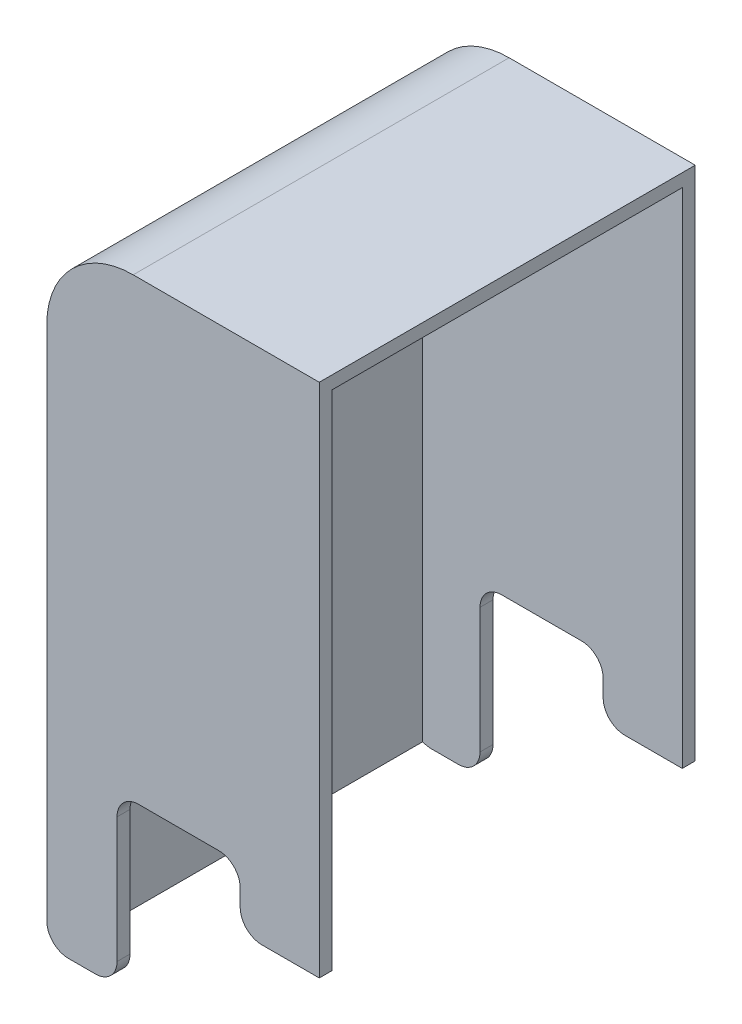
ISO-10303-21;
HEADER;
FILE_DESCRIPTION(('STEP AP214'),'2;1');
FILE_NAME('part.step','',(''),(''),'','','');
FILE_SCHEMA(('AUTOMOTIVE_DESIGN { 1 0 10303 214 1 1 1 1 }'));
ENDSEC;
DATA;
#1=APPLICATION_CONTEXT('core data for automotive mechanical design processes');
#2=APPLICATION_PROTOCOL_DEFINITION('international standard','automotive_design',2000,#1);
#3=PRODUCT_CONTEXT('',#1,'mechanical');
#4=PRODUCT('Part','Part','',(#3));
#5=PRODUCT_RELATED_PRODUCT_CATEGORY('part','',(#4));
#6=PRODUCT_DEFINITION_FORMATION('','',#4);
#7=PRODUCT_DEFINITION_CONTEXT('part definition',#1,'design');
#8=PRODUCT_DEFINITION('design','',#6,#7);
#9=PRODUCT_DEFINITION_SHAPE('','',#8);
#10=(LENGTH_UNIT() NAMED_UNIT(*) SI_UNIT(.MILLI.,.METRE.));
#11=(NAMED_UNIT(*) PLANE_ANGLE_UNIT() SI_UNIT($,.RADIAN.));
#12=(NAMED_UNIT(*) SI_UNIT($,.STERADIAN.) SOLID_ANGLE_UNIT());
#13=UNCERTAINTY_MEASURE_WITH_UNIT(LENGTH_MEASURE(1.E-05),#10,'distance_accuracy_value','');
#14=(GEOMETRIC_REPRESENTATION_CONTEXT(3) GLOBAL_UNCERTAINTY_ASSIGNED_CONTEXT((#13)) GLOBAL_UNIT_ASSIGNED_CONTEXT((#10,
#11,#12)) REPRESENTATION_CONTEXT('',''));
#15=CARTESIAN_POINT('',(0.,0.,0.));
#16=DIRECTION('',(0.,0.,1.));
#17=DIRECTION('',(1.,0.,0.));
#18=AXIS2_PLACEMENT_3D('',#15,#16,#17);
#19=CARTESIAN_POINT('',(-11.5,51.8937422199394,-1.5));
#20=DIRECTION('',(0.,0.,1.));
#21=DIRECTION('',(1.,0.,0.));
#22=AXIS2_PLACEMENT_3D('',#19,#20,#21);
#23=PLANE('',#22);
#24=DIRECTION('',(0.,-1.,0.));
#25=VECTOR('',#24,1.);
#26=CARTESIAN_POINT('',(-28.5,-67.6062577800606,-1.5));
#27=LINE('',#26,#25);
#28=CARTESIAN_POINT('',(-28.5,51.8937422199392,-1.5));
#29=VERTEX_POINT('',#28);
#30=CARTESIAN_POINT('',(-28.5,-72.1888334750165,-1.5));
#31=VERTEX_POINT('',#30);
#32=EDGE_CURVE('E48',#29,#31,#27,.T.);
#33=ORIENTED_EDGE('',*,*,#32,.F.);
#34=CARTESIAN_POINT('',(-11.5,51.8937422199394,-1.5));
#35=DIRECTION('',(0.,0.,1.));
#36=DIRECTION('',(-1.,0.,0.));
#37=AXIS2_PLACEMENT_3D('',#34,#35,#36);
#38=CIRCLE('',#37,17.);
#39=CARTESIAN_POINT('',(-11.4999999999999,68.8937422199394,-1.5));
#40=VERTEX_POINT('',#39);
#41=EDGE_CURVE('E332',#40,#29,#38,.T.);
#42=ORIENTED_EDGE('',*,*,#41,.F.);
#43=DIRECTION('',(-1.,0.,0.));
#44=VECTOR('',#43,1.);
#45=CARTESIAN_POINT('',(-11.4999999999999,68.8937422199394,-1.5));
#46=LINE('',#45,#44);
#47=CARTESIAN_POINT('',(31.56,68.8937422199394,-1.5));
#48=VERTEX_POINT('',#47);
#49=EDGE_CURVE('E54',#48,#40,#46,.T.);
#50=ORIENTED_EDGE('',*,*,#49,.F.);
#51=DIRECTION('',(0.,1.,0.));
#52=VECTOR('',#51,1.);
#53=CARTESIAN_POINT('',(31.56,-47.5062577800607,-1.5));
#54=LINE('',#53,#52);
#55=CARTESIAN_POINT('',(31.56,-47.5062577800607,-1.5));
#56=VERTEX_POINT('',#55);
#57=EDGE_CURVE('E379',#56,#48,#54,.T.);
#58=ORIENTED_EDGE('',*,*,#57,.F.);
#59=DIRECTION('',(1.,0.,0.));
#60=VECTOR('',#59,1.);
#61=CARTESIAN_POINT('',(18.2600000000001,-47.5062577800607,-1.5));
#62=LINE('',#61,#60);
#63=CARTESIAN_POINT('',(18.2600000000001,-47.5062577800607,-1.5));
#64=VERTEX_POINT('',#63);
#65=EDGE_CURVE('E346',#64,#56,#62,.T.);
#66=ORIENTED_EDGE('',*,*,#65,.F.);
#67=CARTESIAN_POINT('',(18.26,-42.5062577800607,-1.5));
#68=DIRECTION('',(0.,0.,1.));
#69=DIRECTION('',(1.,0.,0.));
#70=AXIS2_PLACEMENT_3D('',#67,#68,#69);
#71=CIRCLE('',#70,5.);
#72=CARTESIAN_POINT('',(13.26,-42.5062577800606,-1.5));
#73=VERTEX_POINT('',#72);
#74=EDGE_CURVE('E351',#73,#64,#71,.T.);
#75=ORIENTED_EDGE('',*,*,#74,.F.);
#76=DIRECTION('',(0.,-1.,0.));
#77=VECTOR('',#76,1.);
#78=CARTESIAN_POINT('',(13.26,-38.6062577800607,-1.5));
#79=LINE('',#78,#77);
#80=CARTESIAN_POINT('',(13.26,-38.6062577800607,-1.5));
#81=VERTEX_POINT('',#80);
#82=EDGE_CURVE('E395',#81,#73,#79,.T.);
#83=ORIENTED_EDGE('',*,*,#82,.F.);
#84=CARTESIAN_POINT('',(8.26000000000002,-38.6062577800606,-1.5));
#85=DIRECTION('',(0.,0.,-1.));
#86=DIRECTION('',(-1.,0.,0.));
#87=AXIS2_PLACEMENT_3D('',#84,#85,#86);
#88=CIRCLE('',#87,5.);
#89=CARTESIAN_POINT('',(8.25999999999999,-33.6062577800607,-1.5));
#90=VERTEX_POINT('',#89);
#91=EDGE_CURVE('E393',#90,#81,#88,.T.);
#92=ORIENTED_EDGE('',*,*,#91,.F.);
#93=DIRECTION('',(1.,0.,0.));
#94=VECTOR('',#93,1.);
#95=CARTESIAN_POINT('',(-10.2399999999999,-33.6062577800607,-1.5));
#96=LINE('',#95,#94);
#97=CARTESIAN_POINT('',(-10.2399999999999,-33.6062577800607,-1.5));
#98=VERTEX_POINT('',#97);
#99=EDGE_CURVE('E391',#98,#90,#96,.T.);
#100=ORIENTED_EDGE('',*,*,#99,.F.);
#101=CARTESIAN_POINT('',(-10.24,-38.6062577800606,-1.5));
#102=DIRECTION('',(0.,0.,-1.));
#103=DIRECTION('',(-1.,0.,0.));
#104=AXIS2_PLACEMENT_3D('',#101,#102,#103);
#105=CIRCLE('',#104,5.);
#106=CARTESIAN_POINT('',(-15.24,-38.6062577800607,-1.5));
#107=VERTEX_POINT('',#106);
#108=EDGE_CURVE('E389',#107,#98,#105,.T.);
#109=ORIENTED_EDGE('',*,*,#108,.F.);
#110=DIRECTION('',(0.,1.,0.));
#111=VECTOR('',#110,1.);
#112=CARTESIAN_POINT('',(-15.24,-67.6062577800606,-1.5));
#113=LINE('',#112,#111);
#114=CARTESIAN_POINT('',(-15.24,-67.6062577800606,-1.5));
#115=VERTEX_POINT('',#114);
#116=EDGE_CURVE('E387',#115,#107,#113,.T.);
#117=ORIENTED_EDGE('',*,*,#116,.F.);
#118=CARTESIAN_POINT('',(-20.24,-67.6062577800606,-1.5));
#119=DIRECTION('',(0.,0.,1.));
#120=DIRECTION('',(1.,0.,0.));
#121=AXIS2_PLACEMENT_3D('',#118,#119,#120);
#122=CIRCLE('',#121,5.);
#123=CARTESIAN_POINT('',(-20.24,-72.6062577800606,-1.5));
#124=VERTEX_POINT('',#123);
#125=EDGE_CURVE('E385',#124,#115,#122,.T.);
#126=ORIENTED_EDGE('',*,*,#125,.F.);
#127=DIRECTION('',(1.,0.,0.));
#128=VECTOR('',#127,1.);
#129=CARTESIAN_POINT('',(-26.5,-72.6062577800606,-1.5));
#130=LINE('',#129,#128);
#131=CARTESIAN_POINT('',(-26.5,-72.6062577800606,-1.5));
#132=VERTEX_POINT('',#131);
#133=EDGE_CURVE('E383',#132,#124,#130,.T.);
#134=ORIENTED_EDGE('',*,*,#133,.F.);
#135=CARTESIAN_POINT('',(-26.5,-67.6062577800606,-1.5));
#136=DIRECTION('',(0.,0.,1.));
#137=DIRECTION('',(1.,0.,0.));
#138=AXIS2_PLACEMENT_3D('',#135,#136,#137);
#139=CIRCLE('',#138,5.);
#140=EDGE_CURVE('E381',#31,#132,#139,.T.);
#141=ORIENTED_EDGE('',*,*,#140,.F.);
#142=EDGE_LOOP('',(#33,#42,#50,#58,#66,#75,#83,#92,#100,#109,#117,#126,#134,#141));
#143=FACE_BOUND('',#142,.T.);
#144=ADVANCED_FACE('F33',(#143),#23,.F.);
#145=CARTESIAN_POINT('',(18.2600000000001,-47.5062577800607,1.5));
#146=DIRECTION('',(0.,1.,0.));
#147=DIRECTION('',(0.,0.,1.));
#148=AXIS2_PLACEMENT_3D('',#145,#146,#147);
#149=PLANE('',#148);
#150=ORIENTED_EDGE('',*,*,#65,.T.);
#151=DIRECTION('',(0.,0.,-1.));
#152=VECTOR('',#151,1.);
#153=CARTESIAN_POINT('',(31.56,-47.5062577800607,1.5));
#154=LINE('',#153,#152);
#155=CARTESIAN_POINT('',(31.56,-47.5062577800607,1.5));
#156=VERTEX_POINT('',#155);
#157=EDGE_CURVE('E11',#156,#56,#154,.T.);
#158=ORIENTED_EDGE('',*,*,#157,.F.);
#159=DIRECTION('',(1.,0.,0.));
#160=VECTOR('',#159,1.);
#161=CARTESIAN_POINT('',(18.2600000000001,-47.5062577800607,1.5));
#162=LINE('',#161,#160);
#163=CARTESIAN_POINT('',(18.2600000000001,-47.5062577800607,1.5));
#164=VERTEX_POINT('',#163);
#165=EDGE_CURVE('E347',#164,#156,#162,.T.);
#166=ORIENTED_EDGE('',*,*,#165,.F.);
#167=DIRECTION('',(0.,0.,-1.));
#168=VECTOR('',#167,1.);
#169=CARTESIAN_POINT('',(18.2600000000001,-47.5062577800607,1.5));
#170=LINE('',#169,#168);
#171=EDGE_CURVE('E376',#164,#64,#170,.T.);
#172=ORIENTED_EDGE('',*,*,#171,.T.);
#173=EDGE_LOOP('',(#150,#158,#166,#172));
#174=FACE_BOUND('',#173,.T.);
#175=ADVANCED_FACE('F35',(#174),#149,.F.);
#176=CARTESIAN_POINT('',(31.56,-47.5062577800607,1.5));
#177=DIRECTION('',(-1.,0.,0.));
#178=DIRECTION('',(0.,0.,1.));
#179=AXIS2_PLACEMENT_3D('',#176,#177,#178);
#180=PLANE('',#179);
#181=ORIENTED_EDGE('',*,*,#57,.T.);
#182=DIRECTION('',(0.,0.,1.));
#183=VECTOR('',#182,1.);
#184=CARTESIAN_POINT('',(31.56,68.8937422199394,-82.5));
#185=LINE('',#184,#183);
#186=CARTESIAN_POINT('',(31.56,68.8937422199394,-82.5));
#187=VERTEX_POINT('',#186);
#188=EDGE_CURVE('E343',#187,#48,#185,.T.);
#189=ORIENTED_EDGE('',*,*,#188,.F.);
#190=DIRECTION('',(0.,-1.,0.));
#191=VECTOR('',#190,1.);
#192=CARTESIAN_POINT('',(31.56,68.8937422199394,-82.5));
#193=LINE('',#192,#191);
#194=CARTESIAN_POINT('',(31.56,-47.5062577800607,-82.5));
#195=VERTEX_POINT('',#194);
#196=EDGE_CURVE('E274',#187,#195,#193,.T.);
#197=ORIENTED_EDGE('',*,*,#196,.T.);
#198=DIRECTION('',(0.,0.,1.));
#199=VECTOR('',#198,1.);
#200=CARTESIAN_POINT('',(31.56,-47.5062577800607,-85.5));
#201=LINE('',#200,#199);
#202=CARTESIAN_POINT('',(31.56,-47.5062577800607,-85.5));
#203=VERTEX_POINT('',#202);
#204=EDGE_CURVE('E318',#203,#195,#201,.T.);
#205=ORIENTED_EDGE('',*,*,#204,.F.);
#206=DIRECTION('',(0.,-1.,0.));
#207=VECTOR('',#206,1.);
#208=CARTESIAN_POINT('',(31.56,68.8937422199394,-85.5));
#209=LINE('',#208,#207);
#210=CARTESIAN_POINT('',(31.56,71.8937422199394,-85.5));
#211=VERTEX_POINT('',#210);
#212=EDGE_CURVE('E254',#211,#203,#209,.T.);
#213=ORIENTED_EDGE('',*,*,#212,.F.);
#214=DIRECTION('',(0.,0.,-1.));
#215=VECTOR('',#214,1.);
#216=CARTESIAN_POINT('',(31.56,71.8937422199394,1.5));
#217=LINE('',#216,#215);
#218=CARTESIAN_POINT('',(31.56,71.8937422199394,1.5));
#219=VERTEX_POINT('',#218);
#220=EDGE_CURVE('E41',#219,#211,#217,.T.);
#221=ORIENTED_EDGE('',*,*,#220,.F.);
#222=DIRECTION('',(0.,1.,0.));
#223=VECTOR('',#222,1.);
#224=CARTESIAN_POINT('',(31.56,-47.5062577800607,1.5));
#225=LINE('',#224,#223);
#226=EDGE_CURVE('E350',#156,#219,#225,.T.);
#227=ORIENTED_EDGE('',*,*,#226,.F.);
#228=ORIENTED_EDGE('',*,*,#157,.T.);
#229=EDGE_LOOP('',(#181,#189,#197,#205,#213,#221,#227,#228));
#230=FACE_BOUND('',#229,.T.);
#231=ADVANCED_FACE('F434',(#230),#180,.F.);
#232=CARTESIAN_POINT('',(31.56,71.8937422199394,1.5));
#233=DIRECTION('',(0.,-1.,0.));
#234=DIRECTION('',(1.,0.,0.));
#235=AXIS2_PLACEMENT_3D('',#232,#233,#234);
#236=PLANE('',#235);
#237=ORIENTED_EDGE('',*,*,#220,.T.);
#238=DIRECTION('',(1.,0.,0.));
#239=VECTOR('',#238,1.);
#240=CARTESIAN_POINT('',(-11.4999999999999,71.8937422199394,-85.5));
#241=LINE('',#240,#239);
#242=CARTESIAN_POINT('',(-11.4999999999999,71.8937422199394,-85.5));
#243=VERTEX_POINT('',#242);
#244=EDGE_CURVE('E251',#243,#211,#241,.T.);
#245=ORIENTED_EDGE('',*,*,#244,.F.);
#246=DIRECTION('',(0.,0.,-1.));
#247=VECTOR('',#246,1.);
#248=CARTESIAN_POINT('',(-11.4999999999999,71.8937422199394,1.5));
#249=LINE('',#248,#247);
#250=CARTESIAN_POINT('',(-11.4999999999999,71.8937422199394,1.5));
#251=VERTEX_POINT('',#250);
#252=EDGE_CURVE('E424',#251,#243,#249,.T.);
#253=ORIENTED_EDGE('',*,*,#252,.F.);
#254=DIRECTION('',(-1.,0.,0.));
#255=VECTOR('',#254,1.);
#256=CARTESIAN_POINT('',(31.56,71.8937422199394,1.5));
#257=LINE('',#256,#255);
#258=EDGE_CURVE('E353',#219,#251,#257,.T.);
#259=ORIENTED_EDGE('',*,*,#258,.F.);
#260=EDGE_LOOP('',(#237,#245,#253,#259));
#261=FACE_BOUND('',#260,.T.);
#262=ADVANCED_FACE('F429',(#261),#236,.F.);
#263=CARTESIAN_POINT('',(-11.5,51.8937422199394,1.5));
#264=DIRECTION('',(0.,0.,-1.));
#265=DIRECTION('',(-1.,0.,0.));
#266=AXIS2_PLACEMENT_3D('',#263,#264,#265);
#267=CYLINDRICAL_SURFACE('',#266,20.);
#268=ORIENTED_EDGE('',*,*,#252,.T.);
#269=CARTESIAN_POINT('',(-11.5,51.8937422199394,-85.5));
#270=DIRECTION('',(0.,0.,-1.));
#271=DIRECTION('',(-1.,0.,0.));
#272=AXIS2_PLACEMENT_3D('',#269,#270,#271);
#273=CIRCLE('',#272,20.);
#274=CARTESIAN_POINT('',(-31.5,51.8937422199392,-85.5));
#275=VERTEX_POINT('',#274);
#276=EDGE_CURVE('E238',#275,#243,#273,.T.);
#277=ORIENTED_EDGE('',*,*,#276,.F.);
#278=DIRECTION('',(0.,0.,-1.));
#279=VECTOR('',#278,1.);
#280=CARTESIAN_POINT('',(-31.5,51.8937422199392,1.5));
#281=LINE('',#280,#279);
#282=CARTESIAN_POINT('',(-31.5,51.8937422199392,1.5));
#283=VERTEX_POINT('',#282);
#284=EDGE_CURVE('E228',#283,#275,#281,.T.);
#285=ORIENTED_EDGE('',*,*,#284,.F.);
#286=CARTESIAN_POINT('',(-11.5,51.8937422199394,1.5));
#287=DIRECTION('',(0.,0.,1.));
#288=DIRECTION('',(1.,0.,0.));
#289=AXIS2_PLACEMENT_3D('',#286,#287,#288);
#290=CIRCLE('',#289,20.);
#291=EDGE_CURVE('E355',#251,#283,#290,.T.);
#292=ORIENTED_EDGE('',*,*,#291,.F.);
#293=EDGE_LOOP('',(#268,#277,#285,#292));
#294=FACE_BOUND('',#293,.T.);
#295=ADVANCED_FACE('F508',(#294),#267,.T.);
#296=CARTESIAN_POINT('',(-31.5,51.8937422199392,1.5));
#297=DIRECTION('',(1.,0.,0.));
#298=DIRECTION('',(0.,0.,-1.));
#299=AXIS2_PLACEMENT_3D('',#296,#297,#298);
#300=PLANE('',#299);
#301=ORIENTED_EDGE('',*,*,#284,.T.);
#302=DIRECTION('',(0.,1.,0.));
#303=VECTOR('',#302,1.);
#304=CARTESIAN_POINT('',(-31.5,-67.6062577800606,-85.5));
#305=LINE('',#304,#303);
#306=CARTESIAN_POINT('',(-31.5,-67.6062577800606,-85.5));
#307=VERTEX_POINT('',#306);
#308=EDGE_CURVE('E232',#307,#275,#305,.T.);
#309=ORIENTED_EDGE('',*,*,#308,.F.);
#310=DIRECTION('',(0.,0.,-1.));
#311=VECTOR('',#310,1.);
#312=CARTESIAN_POINT('',(-31.5,-67.6062577800606,1.5));
#313=LINE('',#312,#311);
#314=CARTESIAN_POINT('',(-31.5,-67.6062577800606,1.5));
#315=VERTEX_POINT('',#314);
#316=EDGE_CURVE('E217',#315,#307,#313,.T.);
#317=ORIENTED_EDGE('',*,*,#316,.F.);
#318=DIRECTION('',(0.,-1.,0.));
#319=VECTOR('',#318,1.);
#320=CARTESIAN_POINT('',(-31.5,51.8937422199392,1.5));
#321=LINE('',#320,#319);
#322=EDGE_CURVE('E357',#283,#315,#321,.T.);
#323=ORIENTED_EDGE('',*,*,#322,.F.);
#324=EDGE_LOOP('',(#301,#309,#317,#323));
#325=FACE_BOUND('',#324,.T.);
#326=ADVANCED_FACE('F233',(#325),#300,.F.);
#327=CARTESIAN_POINT('',(-26.5,-67.6062577800606,1.5));
#328=DIRECTION('',(0.,0.,-1.));
#329=DIRECTION('',(-1.,0.,0.));
#330=AXIS2_PLACEMENT_3D('',#327,#328,#329);
#331=CYLINDRICAL_SURFACE('',#330,5.);
#332=ORIENTED_EDGE('',*,*,#316,.T.);
#333=CARTESIAN_POINT('',(-26.5,-67.6062577800606,-85.5));
#334=DIRECTION('',(0.,0.,-1.));
#335=DIRECTION('',(-1.,0.,0.));
#336=AXIS2_PLACEMENT_3D('',#333,#334,#335);
#337=CIRCLE('',#336,4.99999999999999);
#338=CARTESIAN_POINT('',(-26.5,-72.6062577800606,-85.5));
#339=VERTEX_POINT('',#338);
#340=EDGE_CURVE('E222',#339,#307,#337,.T.);
#341=ORIENTED_EDGE('',*,*,#340,.F.);
#342=DIRECTION('',(0.,0.,1.));
#343=VECTOR('',#342,1.);
#344=CARTESIAN_POINT('',(-26.5,-72.6062577800606,-85.5));
#345=LINE('',#344,#343);
#346=CARTESIAN_POINT('',(-26.5,-72.6062577800606,-82.5));
#347=VERTEX_POINT('',#346);
#348=EDGE_CURVE('E273',#339,#347,#345,.T.);
#349=ORIENTED_EDGE('',*,*,#348,.T.);
#350=CARTESIAN_POINT('',(-26.5,-67.6062577800606,-82.5));
#351=DIRECTION('',(0.,0.,-1.));
#352=DIRECTION('',(-1.,0.,0.));
#353=AXIS2_PLACEMENT_3D('',#350,#351,#352);
#354=CIRCLE('',#353,4.99999999999999);
#355=CARTESIAN_POINT('',(-28.5,-72.1888334750165,-82.5));
#356=VERTEX_POINT('',#355);
#357=EDGE_CURVE('E244',#347,#356,#354,.T.);
#358=ORIENTED_EDGE('',*,*,#357,.T.);
#359=DIRECTION('',(0.,0.,1.));
#360=VECTOR('',#359,1.);
#361=CARTESIAN_POINT('',(-28.5,-72.1888334750165,-82.5));
#362=LINE('',#361,#360);
#363=EDGE_CURVE('E330',#356,#31,#362,.T.);
#364=ORIENTED_EDGE('',*,*,#363,.T.);
#365=ORIENTED_EDGE('',*,*,#140,.T.);
#366=DIRECTION('',(0.,0.,-1.));
#367=VECTOR('',#366,1.);
#368=CARTESIAN_POINT('',(-26.5,-72.6062577800606,1.5));
#369=LINE('',#368,#367);
#370=CARTESIAN_POINT('',(-26.5,-72.6062577800606,1.5));
#371=VERTEX_POINT('',#370);
#372=EDGE_CURVE('E229',#371,#132,#369,.T.);
#373=ORIENTED_EDGE('',*,*,#372,.F.);
#374=CARTESIAN_POINT('',(-26.5,-67.6062577800606,1.5));
#375=DIRECTION('',(0.,0.,1.));
#376=DIRECTION('',(1.,0.,0.));
#377=AXIS2_PLACEMENT_3D('',#374,#375,#376);
#378=CIRCLE('',#377,5.);
#379=EDGE_CURVE('E225',#315,#371,#378,.T.);
#380=ORIENTED_EDGE('',*,*,#379,.F.);
#381=EDGE_LOOP('',(#332,#341,#349,#358,#364,#365,#373,#380));
#382=FACE_BOUND('',#381,.T.);
#383=ADVANCED_FACE('F219',(#382),#331,.T.);
#384=CARTESIAN_POINT('',(-26.5,-72.6062577800606,1.5));
#385=DIRECTION('',(0.,1.,0.));
#386=DIRECTION('',(-1.,0.,0.));
#387=AXIS2_PLACEMENT_3D('',#384,#385,#386);
#388=PLANE('',#387);
#389=ORIENTED_EDGE('',*,*,#133,.T.);
#390=DIRECTION('',(0.,0.,-1.));
#391=VECTOR('',#390,1.);
#392=CARTESIAN_POINT('',(-20.24,-72.6062577800606,1.5));
#393=LINE('',#392,#391);
#394=CARTESIAN_POINT('',(-20.24,-72.6062577800606,1.5));
#395=VERTEX_POINT('',#394);
#396=EDGE_CURVE('E418',#395,#124,#393,.T.);
#397=ORIENTED_EDGE('',*,*,#396,.F.);
#398=DIRECTION('',(1.,0.,0.));
#399=VECTOR('',#398,1.);
#400=CARTESIAN_POINT('',(-26.5,-72.6062577800606,1.5));
#401=LINE('',#400,#399);
#402=EDGE_CURVE('E360',#371,#395,#401,.T.);
#403=ORIENTED_EDGE('',*,*,#402,.F.);
#404=ORIENTED_EDGE('',*,*,#372,.T.);
#405=EDGE_LOOP('',(#389,#397,#403,#404));
#406=FACE_BOUND('',#405,.T.);
#407=ADVANCED_FACE('F489',(#406),#388,.F.);
#408=CARTESIAN_POINT('',(-20.24,-67.6062577800606,1.5));
#409=DIRECTION('',(0.,0.,-1.));
#410=DIRECTION('',(-1.,0.,0.));
#411=AXIS2_PLACEMENT_3D('',#408,#409,#410);
#412=CYLINDRICAL_SURFACE('',#411,5.);
#413=ORIENTED_EDGE('',*,*,#125,.T.);
#414=DIRECTION('',(0.,0.,-1.));
#415=VECTOR('',#414,1.);
#416=CARTESIAN_POINT('',(-15.24,-67.6062577800606,1.5));
#417=LINE('',#416,#415);
#418=CARTESIAN_POINT('',(-15.24,-67.6062577800606,1.5));
#419=VERTEX_POINT('',#418);
#420=EDGE_CURVE('E415',#419,#115,#417,.T.);
#421=ORIENTED_EDGE('',*,*,#420,.F.);
#422=CARTESIAN_POINT('',(-20.24,-67.6062577800606,1.5));
#423=DIRECTION('',(0.,0.,1.));
#424=DIRECTION('',(1.,0.,0.));
#425=AXIS2_PLACEMENT_3D('',#422,#423,#424);
#426=CIRCLE('',#425,5.);
#427=EDGE_CURVE('E362',#395,#419,#426,.T.);
#428=ORIENTED_EDGE('',*,*,#427,.F.);
#429=ORIENTED_EDGE('',*,*,#396,.T.);
#430=EDGE_LOOP('',(#413,#421,#428,#429));
#431=FACE_BOUND('',#430,.T.);
#432=ADVANCED_FACE('F496',(#431),#412,.T.);
#433=CARTESIAN_POINT('',(-15.24,-67.6062577800606,1.5));
#434=DIRECTION('',(-1.,0.,0.));
#435=DIRECTION('',(0.,0.,1.));
#436=AXIS2_PLACEMENT_3D('',#433,#434,#435);
#437=PLANE('',#436);
#438=ORIENTED_EDGE('',*,*,#116,.T.);
#439=DIRECTION('',(0.,0.,-1.));
#440=VECTOR('',#439,1.);
#441=CARTESIAN_POINT('',(-15.24,-38.6062577800607,1.5));
#442=LINE('',#441,#440);
#443=CARTESIAN_POINT('',(-15.24,-38.6062577800607,1.5));
#444=VERTEX_POINT('',#443);
#445=EDGE_CURVE('E412',#444,#107,#442,.T.);
#446=ORIENTED_EDGE('',*,*,#445,.F.);
#447=DIRECTION('',(0.,1.,0.));
#448=VECTOR('',#447,1.);
#449=CARTESIAN_POINT('',(-15.24,-67.6062577800606,1.5));
#450=LINE('',#449,#448);
#451=EDGE_CURVE('E364',#419,#444,#450,.T.);
#452=ORIENTED_EDGE('',*,*,#451,.F.);
#453=ORIENTED_EDGE('',*,*,#420,.T.);
#454=EDGE_LOOP('',(#438,#446,#452,#453));
#455=FACE_BOUND('',#454,.T.);
#456=ADVANCED_FACE('F500',(#455),#437,.F.);
#457=CARTESIAN_POINT('',(-10.24,-38.6062577800606,1.5));
#458=DIRECTION('',(0.,0.,-1.));
#459=DIRECTION('',(-1.,0.,0.));
#460=AXIS2_PLACEMENT_3D('',#457,#458,#459);
#461=CYLINDRICAL_SURFACE('',#460,5.);
#462=ORIENTED_EDGE('',*,*,#108,.T.);
#463=DIRECTION('',(0.,0.,-1.));
#464=VECTOR('',#463,1.);
#465=CARTESIAN_POINT('',(-10.2399999999999,-33.6062577800607,1.5));
#466=LINE('',#465,#464);
#467=CARTESIAN_POINT('',(-10.2399999999999,-33.6062577800607,1.5));
#468=VERTEX_POINT('',#467);
#469=EDGE_CURVE('E409',#468,#98,#466,.T.);
#470=ORIENTED_EDGE('',*,*,#469,.F.);
#471=CARTESIAN_POINT('',(-10.24,-38.6062577800606,1.5));
#472=DIRECTION('',(0.,0.,-1.));
#473=DIRECTION('',(-1.,0.,0.));
#474=AXIS2_PLACEMENT_3D('',#471,#472,#473);
#475=CIRCLE('',#474,5.);
#476=EDGE_CURVE('E366',#444,#468,#475,.T.);
#477=ORIENTED_EDGE('',*,*,#476,.F.);
#478=ORIENTED_EDGE('',*,*,#445,.T.);
#479=EDGE_LOOP('',(#462,#470,#477,#478));
#480=FACE_BOUND('',#479,.T.);
#481=ADVANCED_FACE('F541',(#480),#461,.F.);
#482=CARTESIAN_POINT('',(-10.2399999999999,-33.6062577800607,1.5));
#483=DIRECTION('',(0.,1.,0.));
#484=DIRECTION('',(0.,0.,1.));
#485=AXIS2_PLACEMENT_3D('',#482,#483,#484);
#486=PLANE('',#485);
#487=ORIENTED_EDGE('',*,*,#99,.T.);
#488=DIRECTION('',(0.,0.,-1.));
#489=VECTOR('',#488,1.);
#490=CARTESIAN_POINT('',(8.25999999999999,-33.6062577800607,1.5));
#491=LINE('',#490,#489);
#492=CARTESIAN_POINT('',(8.25999999999999,-33.6062577800607,1.5));
#493=VERTEX_POINT('',#492);
#494=EDGE_CURVE('E406',#493,#90,#491,.T.);
#495=ORIENTED_EDGE('',*,*,#494,.F.);
#496=DIRECTION('',(1.,0.,0.));
#497=VECTOR('',#496,1.);
#498=CARTESIAN_POINT('',(-10.2399999999999,-33.6062577800607,1.5));
#499=LINE('',#498,#497);
#500=EDGE_CURVE('E368',#468,#493,#499,.T.);
#501=ORIENTED_EDGE('',*,*,#500,.F.);
#502=ORIENTED_EDGE('',*,*,#469,.T.);
#503=EDGE_LOOP('',(#487,#495,#501,#502));
#504=FACE_BOUND('',#503,.T.);
#505=ADVANCED_FACE('F537',(#504),#486,.F.);
#506=CARTESIAN_POINT('',(8.26000000000002,-38.6062577800606,1.5));
#507=DIRECTION('',(0.,0.,-1.));
#508=DIRECTION('',(-1.,0.,0.));
#509=AXIS2_PLACEMENT_3D('',#506,#507,#508);
#510=CYLINDRICAL_SURFACE('',#509,5.);
#511=ORIENTED_EDGE('',*,*,#91,.T.);
#512=DIRECTION('',(0.,0.,-1.));
#513=VECTOR('',#512,1.);
#514=CARTESIAN_POINT('',(13.26,-38.6062577800607,1.5));
#515=LINE('',#514,#513);
#516=CARTESIAN_POINT('',(13.26,-38.6062577800607,1.5));
#517=VERTEX_POINT('',#516);
#518=EDGE_CURVE('E403',#517,#81,#515,.T.);
#519=ORIENTED_EDGE('',*,*,#518,.F.);
#520=CARTESIAN_POINT('',(8.26000000000002,-38.6062577800606,1.5));
#521=DIRECTION('',(0.,0.,-1.));
#522=DIRECTION('',(-1.,0.,0.));
#523=AXIS2_PLACEMENT_3D('',#520,#521,#522);
#524=CIRCLE('',#523,5.);
#525=EDGE_CURVE('E370',#493,#517,#524,.T.);
#526=ORIENTED_EDGE('',*,*,#525,.F.);
#527=ORIENTED_EDGE('',*,*,#494,.T.);
#528=EDGE_LOOP('',(#511,#519,#526,#527));
#529=FACE_BOUND('',#528,.T.);
#530=ADVANCED_FACE('F533',(#529),#510,.F.);
#531=CARTESIAN_POINT('',(13.26,-38.6062577800607,1.5));
#532=DIRECTION('',(1.,0.,0.));
#533=DIRECTION('',(0.,0.,-1.));
#534=AXIS2_PLACEMENT_3D('',#531,#532,#533);
#535=PLANE('',#534);
#536=ORIENTED_EDGE('',*,*,#82,.T.);
#537=DIRECTION('',(0.,0.,-1.));
#538=VECTOR('',#537,1.);
#539=CARTESIAN_POINT('',(13.26,-42.5062577800606,1.5));
#540=LINE('',#539,#538);
#541=CARTESIAN_POINT('',(13.26,-42.5062577800606,1.5));
#542=VERTEX_POINT('',#541);
#543=EDGE_CURVE('E400',#542,#73,#540,.T.);
#544=ORIENTED_EDGE('',*,*,#543,.F.);
#545=DIRECTION('',(0.,-1.,0.));
#546=VECTOR('',#545,1.);
#547=CARTESIAN_POINT('',(13.26,-38.6062577800607,1.5));
#548=LINE('',#547,#546);
#549=EDGE_CURVE('E372',#517,#542,#548,.T.);
#550=ORIENTED_EDGE('',*,*,#549,.F.);
#551=ORIENTED_EDGE('',*,*,#518,.T.);
#552=EDGE_LOOP('',(#536,#544,#550,#551));
#553=FACE_BOUND('',#552,.T.);
#554=ADVANCED_FACE('F529',(#553),#535,.F.);
#555=CARTESIAN_POINT('',(18.26,-42.5062577800607,1.5));
#556=DIRECTION('',(0.,0.,-1.));
#557=DIRECTION('',(-1.,0.,0.));
#558=AXIS2_PLACEMENT_3D('',#555,#556,#557);
#559=CYLINDRICAL_SURFACE('',#558,5.);
#560=ORIENTED_EDGE('',*,*,#74,.T.);
#561=ORIENTED_EDGE('',*,*,#171,.F.);
#562=CARTESIAN_POINT('',(18.26,-42.5062577800607,1.5));
#563=DIRECTION('',(0.,0.,1.));
#564=DIRECTION('',(1.,0.,0.));
#565=AXIS2_PLACEMENT_3D('',#562,#563,#564);
#566=CIRCLE('',#565,5.);
#567=EDGE_CURVE('E374',#542,#164,#566,.T.);
#568=ORIENTED_EDGE('',*,*,#567,.F.);
#569=ORIENTED_EDGE('',*,*,#543,.T.);
#570=EDGE_LOOP('',(#560,#561,#568,#569));
#571=FACE_BOUND('',#570,.T.);
#572=ADVANCED_FACE('F526',(#571),#559,.T.);
#573=CARTESIAN_POINT('',(-11.5,51.8937422199394,1.5));
#574=DIRECTION('',(0.,0.,1.));
#575=DIRECTION('',(1.,0.,0.));
#576=AXIS2_PLACEMENT_3D('',#573,#574,#575);
#577=PLANE('',#576);
#578=ORIENTED_EDGE('',*,*,#165,.T.);
#579=ORIENTED_EDGE('',*,*,#226,.T.);
#580=ORIENTED_EDGE('',*,*,#258,.T.);
#581=ORIENTED_EDGE('',*,*,#291,.T.);
#582=ORIENTED_EDGE('',*,*,#322,.T.);
#583=ORIENTED_EDGE('',*,*,#379,.T.);
#584=ORIENTED_EDGE('',*,*,#402,.T.);
#585=ORIENTED_EDGE('',*,*,#427,.T.);
#586=ORIENTED_EDGE('',*,*,#451,.T.);
#587=ORIENTED_EDGE('',*,*,#476,.T.);
#588=ORIENTED_EDGE('',*,*,#500,.T.);
#589=ORIENTED_EDGE('',*,*,#525,.T.);
#590=ORIENTED_EDGE('',*,*,#549,.T.);
#591=ORIENTED_EDGE('',*,*,#567,.T.);
#592=EDGE_LOOP('',(#578,#579,#580,#581,#582,#583,#584,#585,#586,#587,#588,#589,#590,#591));
#593=FACE_BOUND('',#592,.T.);
#594=ADVANCED_FACE('F504',(#593),#577,.T.);
#595=CARTESIAN_POINT('',(-11.4999999999999,68.8937422199394,-82.5));
#596=DIRECTION('',(0.,1.,0.));
#597=DIRECTION('',(0.,0.,1.));
#598=AXIS2_PLACEMENT_3D('',#595,#596,#597);
#599=PLANE('',#598);
#600=ORIENTED_EDGE('',*,*,#49,.T.);
#601=DIRECTION('',(0.,0.,1.));
#602=VECTOR('',#601,1.);
#603=CARTESIAN_POINT('',(-11.4999999999999,68.8937422199394,-82.5));
#604=LINE('',#603,#602);
#605=CARTESIAN_POINT('',(-11.4999999999999,68.8937422199394,-82.5));
#606=VERTEX_POINT('',#605);
#607=EDGE_CURVE('E340',#606,#40,#604,.T.);
#608=ORIENTED_EDGE('',*,*,#607,.F.);
#609=DIRECTION('',(-1.,0.,0.));
#610=VECTOR('',#609,1.);
#611=CARTESIAN_POINT('',(28.56,68.8937422199394,-82.5));
#612=LINE('',#611,#610);
#613=EDGE_CURVE('E321',#187,#606,#612,.T.);
#614=ORIENTED_EDGE('',*,*,#613,.F.);
#615=ORIENTED_EDGE('',*,*,#188,.T.);
#616=EDGE_LOOP('',(#600,#608,#614,#615));
#617=FACE_BOUND('',#616,.T.);
#618=ADVANCED_FACE('F597',(#617),#599,.F.);
#619=CARTESIAN_POINT('',(-11.5,51.8937422199394,-82.5));
#620=DIRECTION('',(0.,0.,1.));
#621=DIRECTION('',(1.,0.,0.));
#622=AXIS2_PLACEMENT_3D('',#619,#620,#621);
#623=CYLINDRICAL_SURFACE('',#622,17.);
#624=ORIENTED_EDGE('',*,*,#41,.T.);
#625=DIRECTION('',(0.,0.,1.));
#626=VECTOR('',#625,1.);
#627=CARTESIAN_POINT('',(-28.5,51.8937422199392,-82.5));
#628=LINE('',#627,#626);
#629=CARTESIAN_POINT('',(-28.5,51.8937422199392,-82.5));
#630=VERTEX_POINT('',#629);
#631=EDGE_CURVE('E337',#630,#29,#628,.T.);
#632=ORIENTED_EDGE('',*,*,#631,.F.);
#633=CARTESIAN_POINT('',(-11.5,51.8937422199394,-82.5));
#634=DIRECTION('',(0.,0.,1.));
#635=DIRECTION('',(-1.,0.,0.));
#636=AXIS2_PLACEMENT_3D('',#633,#634,#635);
#637=CIRCLE('',#636,17.);
#638=EDGE_CURVE('E324',#606,#630,#637,.T.);
#639=ORIENTED_EDGE('',*,*,#638,.F.);
#640=ORIENTED_EDGE('',*,*,#607,.T.);
#641=EDGE_LOOP('',(#624,#632,#639,#640));
#642=FACE_BOUND('',#641,.T.);
#643=ADVANCED_FACE('F602',(#642),#623,.F.);
#644=CARTESIAN_POINT('',(-28.5,-67.6062577800606,-82.5));
#645=DIRECTION('',(-1.,0.,0.));
#646=DIRECTION('',(0.,0.,1.));
#647=AXIS2_PLACEMENT_3D('',#644,#645,#646);
#648=PLANE('',#647);
#649=ORIENTED_EDGE('',*,*,#32,.T.);
#650=ORIENTED_EDGE('',*,*,#363,.F.);
#651=DIRECTION('',(0.,-1.,0.));
#652=VECTOR('',#651,1.);
#653=CARTESIAN_POINT('',(-28.5,-67.6062577800606,-82.5));
#654=LINE('',#653,#652);
#655=EDGE_CURVE('E327',#630,#356,#654,.T.);
#656=ORIENTED_EDGE('',*,*,#655,.F.);
#657=ORIENTED_EDGE('',*,*,#631,.T.);
#658=EDGE_LOOP('',(#649,#650,#656,#657));
#659=FACE_BOUND('',#658,.T.);
#660=ADVANCED_FACE('F485',(#659),#648,.F.);
#661=CARTESIAN_POINT('',(-26.5,-67.6062577800606,-82.5));
#662=DIRECTION('',(0.,0.,-1.));
#663=DIRECTION('',(-1.,0.,0.));
#664=AXIS2_PLACEMENT_3D('',#661,#662,#663);
#665=PLANE('',#664);
#666=ORIENTED_EDGE('',*,*,#196,.F.);
#667=ORIENTED_EDGE('',*,*,#613,.T.);
#668=ORIENTED_EDGE('',*,*,#638,.T.);
#669=ORIENTED_EDGE('',*,*,#655,.T.);
#670=ORIENTED_EDGE('',*,*,#357,.F.);
#671=DIRECTION('',(-1.,0.,0.));
#672=VECTOR('',#671,1.);
#673=CARTESIAN_POINT('',(-20.24,-72.6062577800606,-82.5));
#674=LINE('',#673,#672);
#675=CARTESIAN_POINT('',(-20.24,-72.6062577800606,-82.5));
#676=VERTEX_POINT('',#675);
#677=EDGE_CURVE('E247',#676,#347,#674,.T.);
#678=ORIENTED_EDGE('',*,*,#677,.F.);
#679=CARTESIAN_POINT('',(-20.24,-67.6062577800606,-82.5));
#680=DIRECTION('',(0.,0.,-1.));
#681=DIRECTION('',(-1.,0.,0.));
#682=AXIS2_PLACEMENT_3D('',#679,#680,#681);
#683=CIRCLE('',#682,5.);
#684=CARTESIAN_POINT('',(-15.24,-67.6062577800606,-82.5));
#685=VERTEX_POINT('',#684);
#686=EDGE_CURVE('E290',#685,#676,#683,.T.);
#687=ORIENTED_EDGE('',*,*,#686,.F.);
#688=DIRECTION('',(0.,-1.,0.));
#689=VECTOR('',#688,1.);
#690=CARTESIAN_POINT('',(-15.24,-38.6062577800607,-82.5));
#691=LINE('',#690,#689);
#692=CARTESIAN_POINT('',(-15.24,-38.6062577800607,-82.5));
#693=VERTEX_POINT('',#692);
#694=EDGE_CURVE('E288',#693,#685,#691,.T.);
#695=ORIENTED_EDGE('',*,*,#694,.F.);
#696=CARTESIAN_POINT('',(-10.24,-38.6062577800606,-82.5));
#697=DIRECTION('',(0.,0.,1.));
#698=DIRECTION('',(-1.,0.,0.));
#699=AXIS2_PLACEMENT_3D('',#696,#697,#698);
#700=CIRCLE('',#699,5.);
#701=CARTESIAN_POINT('',(-10.2399999999999,-33.6062577800607,-82.5));
#702=VERTEX_POINT('',#701);
#703=EDGE_CURVE('E286',#702,#693,#700,.T.);
#704=ORIENTED_EDGE('',*,*,#703,.F.);
#705=DIRECTION('',(-1.,0.,0.));
#706=VECTOR('',#705,1.);
#707=CARTESIAN_POINT('',(8.25999999999999,-33.6062577800607,-82.5));
#708=LINE('',#707,#706);
#709=CARTESIAN_POINT('',(8.25999999999999,-33.6062577800607,-82.5));
#710=VERTEX_POINT('',#709);
#711=EDGE_CURVE('E284',#710,#702,#708,.T.);
#712=ORIENTED_EDGE('',*,*,#711,.F.);
#713=CARTESIAN_POINT('',(8.26000000000002,-38.6062577800606,-82.5));
#714=DIRECTION('',(0.,0.,1.));
#715=DIRECTION('',(-1.,0.,0.));
#716=AXIS2_PLACEMENT_3D('',#713,#714,#715);
#717=CIRCLE('',#716,5.);
#718=CARTESIAN_POINT('',(13.26,-38.6062577800607,-82.5));
#719=VERTEX_POINT('',#718);
#720=EDGE_CURVE('E282',#719,#710,#717,.T.);
#721=ORIENTED_EDGE('',*,*,#720,.F.);
#722=DIRECTION('',(0.,1.,0.));
#723=VECTOR('',#722,1.);
#724=CARTESIAN_POINT('',(13.26,-42.5062577800607,-82.5));
#725=LINE('',#724,#723);
#726=CARTESIAN_POINT('',(13.26,-42.5062577800607,-82.5));
#727=VERTEX_POINT('',#726);
#728=EDGE_CURVE('E280',#727,#719,#725,.T.);
#729=ORIENTED_EDGE('',*,*,#728,.F.);
#730=CARTESIAN_POINT('',(18.26,-42.5062577800607,-82.5));
#731=DIRECTION('',(0.,0.,-1.));
#732=DIRECTION('',(-1.,0.,0.));
#733=AXIS2_PLACEMENT_3D('',#730,#731,#732);
#734=CIRCLE('',#733,5.);
#735=CARTESIAN_POINT('',(18.2600000000001,-47.5062577800607,-82.5));
#736=VERTEX_POINT('',#735);
#737=EDGE_CURVE('E278',#736,#727,#734,.T.);
#738=ORIENTED_EDGE('',*,*,#737,.F.);
#739=DIRECTION('',(-1.,0.,0.));
#740=VECTOR('',#739,1.);
#741=CARTESIAN_POINT('',(31.56,-47.5062577800607,-82.5));
#742=LINE('',#741,#740);
#743=EDGE_CURVE('E276',#195,#736,#742,.T.);
#744=ORIENTED_EDGE('',*,*,#743,.F.);
#745=EDGE_LOOP('',(#666,#667,#668,#669,#670,#678,#687,#695,#704,#712,#721,#729,#738,#744));
#746=FACE_BOUND('',#745,.T.);
#747=ADVANCED_FACE('F481',(#746),#665,.F.);
#748=CARTESIAN_POINT('',(31.56,-47.5062577800607,-85.5));
#749=DIRECTION('',(0.,1.,0.));
#750=DIRECTION('',(0.,0.,1.));
#751=AXIS2_PLACEMENT_3D('',#748,#749,#750);
#752=PLANE('',#751);
#753=ORIENTED_EDGE('',*,*,#743,.T.);
#754=DIRECTION('',(0.,0.,1.));
#755=VECTOR('',#754,1.);
#756=CARTESIAN_POINT('',(18.2600000000001,-47.5062577800607,-85.5));
#757=LINE('',#756,#755);
#758=CARTESIAN_POINT('',(18.2600000000001,-47.5062577800607,-85.5));
#759=VERTEX_POINT('',#758);
#760=EDGE_CURVE('E315',#759,#736,#757,.T.);
#761=ORIENTED_EDGE('',*,*,#760,.F.);
#762=DIRECTION('',(-1.,0.,0.));
#763=VECTOR('',#762,1.);
#764=CARTESIAN_POINT('',(31.56,-47.5062577800607,-85.5));
#765=LINE('',#764,#763);
#766=EDGE_CURVE('E256',#203,#759,#765,.T.);
#767=ORIENTED_EDGE('',*,*,#766,.F.);
#768=ORIENTED_EDGE('',*,*,#204,.T.);
#769=EDGE_LOOP('',(#753,#761,#767,#768));
#770=FACE_BOUND('',#769,.T.);
#771=ADVANCED_FACE('F440',(#770),#752,.F.);
#772=CARTESIAN_POINT('',(18.26,-42.5062577800607,-85.5));
#773=DIRECTION('',(0.,0.,1.));
#774=DIRECTION('',(1.,0.,0.));
#775=AXIS2_PLACEMENT_3D('',#772,#773,#774);
#776=CYLINDRICAL_SURFACE('',#775,5.);
#777=ORIENTED_EDGE('',*,*,#737,.T.);
#778=DIRECTION('',(0.,0.,1.));
#779=VECTOR('',#778,1.);
#780=CARTESIAN_POINT('',(13.26,-42.5062577800607,-85.5));
#781=LINE('',#780,#779);
#782=CARTESIAN_POINT('',(13.26,-42.5062577800607,-85.5));
#783=VERTEX_POINT('',#782);
#784=EDGE_CURVE('E312',#783,#727,#781,.T.);
#785=ORIENTED_EDGE('',*,*,#784,.F.);
#786=CARTESIAN_POINT('',(18.26,-42.5062577800607,-85.5));
#787=DIRECTION('',(0.,0.,-1.));
#788=DIRECTION('',(-1.,0.,0.));
#789=AXIS2_PLACEMENT_3D('',#786,#787,#788);
#790=CIRCLE('',#789,5.);
#791=EDGE_CURVE('E258',#759,#783,#790,.T.);
#792=ORIENTED_EDGE('',*,*,#791,.F.);
#793=ORIENTED_EDGE('',*,*,#760,.T.);
#794=EDGE_LOOP('',(#777,#785,#792,#793));
#795=FACE_BOUND('',#794,.T.);
#796=ADVANCED_FACE('F446',(#795),#776,.T.);
#797=CARTESIAN_POINT('',(13.26,-42.5062577800607,-85.5));
#798=DIRECTION('',(1.,0.,0.));
#799=DIRECTION('',(0.,1.,0.));
#800=AXIS2_PLACEMENT_3D('',#797,#798,#799);
#801=PLANE('',#800);
#802=ORIENTED_EDGE('',*,*,#728,.T.);
#803=DIRECTION('',(0.,0.,1.));
#804=VECTOR('',#803,1.);
#805=CARTESIAN_POINT('',(13.26,-38.6062577800607,-85.5));
#806=LINE('',#805,#804);
#807=CARTESIAN_POINT('',(13.26,-38.6062577800607,-85.5));
#808=VERTEX_POINT('',#807);
#809=EDGE_CURVE('E309',#808,#719,#806,.T.);
#810=ORIENTED_EDGE('',*,*,#809,.F.);
#811=DIRECTION('',(0.,1.,0.));
#812=VECTOR('',#811,1.);
#813=CARTESIAN_POINT('',(13.26,-42.5062577800607,-85.5));
#814=LINE('',#813,#812);
#815=EDGE_CURVE('E260',#783,#808,#814,.T.);
#816=ORIENTED_EDGE('',*,*,#815,.F.);
#817=ORIENTED_EDGE('',*,*,#784,.T.);
#818=EDGE_LOOP('',(#802,#810,#816,#817));
#819=FACE_BOUND('',#818,.T.);
#820=ADVANCED_FACE('F450',(#819),#801,.F.);
#821=CARTESIAN_POINT('',(8.26000000000002,-38.6062577800606,-85.5));
#822=DIRECTION('',(0.,0.,1.));
#823=DIRECTION('',(1.,0.,0.));
#824=AXIS2_PLACEMENT_3D('',#821,#822,#823);
#825=CYLINDRICAL_SURFACE('',#824,5.);
#826=ORIENTED_EDGE('',*,*,#720,.T.);
#827=DIRECTION('',(0.,0.,1.));
#828=VECTOR('',#827,1.);
#829=CARTESIAN_POINT('',(8.25999999999999,-33.6062577800607,-85.5));
#830=LINE('',#829,#828);
#831=CARTESIAN_POINT('',(8.25999999999999,-33.6062577800607,-85.5));
#832=VERTEX_POINT('',#831);
#833=EDGE_CURVE('E306',#832,#710,#830,.T.);
#834=ORIENTED_EDGE('',*,*,#833,.F.);
#835=CARTESIAN_POINT('',(8.26000000000002,-38.6062577800606,-85.5));
#836=DIRECTION('',(0.,0.,1.));
#837=DIRECTION('',(-1.,0.,0.));
#838=AXIS2_PLACEMENT_3D('',#835,#836,#837);
#839=CIRCLE('',#838,5.);
#840=EDGE_CURVE('E262',#808,#832,#839,.T.);
#841=ORIENTED_EDGE('',*,*,#840,.F.);
#842=ORIENTED_EDGE('',*,*,#809,.T.);
#843=EDGE_LOOP('',(#826,#834,#841,#842));
#844=FACE_BOUND('',#843,.T.);
#845=ADVANCED_FACE('F455',(#844),#825,.F.);
#846=CARTESIAN_POINT('',(8.25999999999999,-33.6062577800607,-85.5));
#847=DIRECTION('',(0.,1.,0.));
#848=DIRECTION('',(0.,0.,1.));
#849=AXIS2_PLACEMENT_3D('',#846,#847,#848);
#850=PLANE('',#849);
#851=ORIENTED_EDGE('',*,*,#711,.T.);
#852=DIRECTION('',(0.,0.,1.));
#853=VECTOR('',#852,1.);
#854=CARTESIAN_POINT('',(-10.2399999999999,-33.6062577800607,-85.5));
#855=LINE('',#854,#853);
#856=CARTESIAN_POINT('',(-10.2399999999999,-33.6062577800607,-85.5));
#857=VERTEX_POINT('',#856);
#858=EDGE_CURVE('E303',#857,#702,#855,.T.);
#859=ORIENTED_EDGE('',*,*,#858,.F.);
#860=DIRECTION('',(-1.,0.,0.));
#861=VECTOR('',#860,1.);
#862=CARTESIAN_POINT('',(8.25999999999999,-33.6062577800607,-85.5));
#863=LINE('',#862,#861);
#864=EDGE_CURVE('E264',#832,#857,#863,.T.);
#865=ORIENTED_EDGE('',*,*,#864,.F.);
#866=ORIENTED_EDGE('',*,*,#833,.T.);
#867=EDGE_LOOP('',(#851,#859,#865,#866));
#868=FACE_BOUND('',#867,.T.);
#869=ADVANCED_FACE('F461',(#868),#850,.F.);
#870=CARTESIAN_POINT('',(-10.24,-38.6062577800606,-85.5));
#871=DIRECTION('',(0.,0.,1.));
#872=DIRECTION('',(1.,0.,0.));
#873=AXIS2_PLACEMENT_3D('',#870,#871,#872);
#874=CYLINDRICAL_SURFACE('',#873,5.);
#875=ORIENTED_EDGE('',*,*,#703,.T.);
#876=DIRECTION('',(0.,0.,1.));
#877=VECTOR('',#876,1.);
#878=CARTESIAN_POINT('',(-15.24,-38.6062577800607,-85.5));
#879=LINE('',#878,#877);
#880=CARTESIAN_POINT('',(-15.24,-38.6062577800607,-85.5));
#881=VERTEX_POINT('',#880);
#882=EDGE_CURVE('E300',#881,#693,#879,.T.);
#883=ORIENTED_EDGE('',*,*,#882,.F.);
#884=CARTESIAN_POINT('',(-10.24,-38.6062577800606,-85.5));
#885=DIRECTION('',(0.,0.,1.));
#886=DIRECTION('',(-1.,0.,0.));
#887=AXIS2_PLACEMENT_3D('',#884,#885,#886);
#888=CIRCLE('',#887,5.);
#889=EDGE_CURVE('E266',#857,#881,#888,.T.);
#890=ORIENTED_EDGE('',*,*,#889,.F.);
#891=ORIENTED_EDGE('',*,*,#858,.T.);
#892=EDGE_LOOP('',(#875,#883,#890,#891));
#893=FACE_BOUND('',#892,.T.);
#894=ADVANCED_FACE('F465',(#893),#874,.F.);
#895=CARTESIAN_POINT('',(-15.24,-38.6062577800607,-85.5));
#896=DIRECTION('',(-1.,0.,0.));
#897=DIRECTION('',(0.,-1.,0.));
#898=AXIS2_PLACEMENT_3D('',#895,#896,#897);
#899=PLANE('',#898);
#900=ORIENTED_EDGE('',*,*,#694,.T.);
#901=DIRECTION('',(0.,0.,1.));
#902=VECTOR('',#901,1.);
#903=CARTESIAN_POINT('',(-15.24,-67.6062577800606,-85.5));
#904=LINE('',#903,#902);
#905=CARTESIAN_POINT('',(-15.24,-67.6062577800606,-85.5));
#906=VERTEX_POINT('',#905);
#907=EDGE_CURVE('E297',#906,#685,#904,.T.);
#908=ORIENTED_EDGE('',*,*,#907,.F.);
#909=DIRECTION('',(0.,-1.,0.));
#910=VECTOR('',#909,1.);
#911=CARTESIAN_POINT('',(-15.24,-38.6062577800607,-85.5));
#912=LINE('',#911,#910);
#913=EDGE_CURVE('E268',#881,#906,#912,.T.);
#914=ORIENTED_EDGE('',*,*,#913,.F.);
#915=ORIENTED_EDGE('',*,*,#882,.T.);
#916=EDGE_LOOP('',(#900,#908,#914,#915));
#917=FACE_BOUND('',#916,.T.);
#918=ADVANCED_FACE('F470',(#917),#899,.F.);
#919=CARTESIAN_POINT('',(-20.24,-67.6062577800606,-85.5));
#920=DIRECTION('',(0.,0.,1.));
#921=DIRECTION('',(1.,0.,0.));
#922=AXIS2_PLACEMENT_3D('',#919,#920,#921);
#923=CYLINDRICAL_SURFACE('',#922,5.);
#924=ORIENTED_EDGE('',*,*,#686,.T.);
#925=DIRECTION('',(0.,0.,1.));
#926=VECTOR('',#925,1.);
#927=CARTESIAN_POINT('',(-20.24,-72.6062577800606,-85.5));
#928=LINE('',#927,#926);
#929=CARTESIAN_POINT('',(-20.24,-72.6062577800606,-85.5));
#930=VERTEX_POINT('',#929);
#931=EDGE_CURVE('E294',#930,#676,#928,.T.);
#932=ORIENTED_EDGE('',*,*,#931,.F.);
#933=CARTESIAN_POINT('',(-20.24,-67.6062577800606,-85.5));
#934=DIRECTION('',(0.,0.,-1.));
#935=DIRECTION('',(-1.,0.,0.));
#936=AXIS2_PLACEMENT_3D('',#933,#934,#935);
#937=CIRCLE('',#936,5.);
#938=EDGE_CURVE('E270',#906,#930,#937,.T.);
#939=ORIENTED_EDGE('',*,*,#938,.F.);
#940=ORIENTED_EDGE('',*,*,#907,.T.);
#941=EDGE_LOOP('',(#924,#932,#939,#940));
#942=FACE_BOUND('',#941,.T.);
#943=ADVANCED_FACE('F474',(#942),#923,.T.);
#944=CARTESIAN_POINT('',(-20.24,-72.6062577800606,-85.5));
#945=DIRECTION('',(0.,1.,0.));
#946=DIRECTION('',(-1.,0.,0.));
#947=AXIS2_PLACEMENT_3D('',#944,#945,#946);
#948=PLANE('',#947);
#949=ORIENTED_EDGE('',*,*,#677,.T.);
#950=ORIENTED_EDGE('',*,*,#348,.F.);
#951=DIRECTION('',(-1.,0.,0.));
#952=VECTOR('',#951,1.);
#953=CARTESIAN_POINT('',(-20.24,-72.6062577800606,-85.5));
#954=LINE('',#953,#952);
#955=EDGE_CURVE('E242',#930,#339,#954,.T.);
#956=ORIENTED_EDGE('',*,*,#955,.F.);
#957=ORIENTED_EDGE('',*,*,#931,.T.);
#958=EDGE_LOOP('',(#949,#950,#956,#957));
#959=FACE_BOUND('',#958,.T.);
#960=ADVANCED_FACE('F478',(#959),#948,.F.);
#961=CARTESIAN_POINT('',(-26.5,-67.6062577800606,-85.5));
#962=DIRECTION('',(0.,0.,-1.));
#963=DIRECTION('',(-1.,0.,0.));
#964=AXIS2_PLACEMENT_3D('',#961,#962,#963);
#965=PLANE('',#964);
#966=ORIENTED_EDGE('',*,*,#340,.T.);
#967=ORIENTED_EDGE('',*,*,#308,.T.);
#968=ORIENTED_EDGE('',*,*,#276,.T.);
#969=ORIENTED_EDGE('',*,*,#244,.T.);
#970=ORIENTED_EDGE('',*,*,#212,.T.);
#971=ORIENTED_EDGE('',*,*,#766,.T.);
#972=ORIENTED_EDGE('',*,*,#791,.T.);
#973=ORIENTED_EDGE('',*,*,#815,.T.);
#974=ORIENTED_EDGE('',*,*,#840,.T.);
#975=ORIENTED_EDGE('',*,*,#864,.T.);
#976=ORIENTED_EDGE('',*,*,#889,.T.);
#977=ORIENTED_EDGE('',*,*,#913,.T.);
#978=ORIENTED_EDGE('',*,*,#938,.T.);
#979=ORIENTED_EDGE('',*,*,#955,.T.);
#980=EDGE_LOOP('',(#966,#967,#968,#969,#970,#971,#972,#973,#974,#975,#976,#977,#978,#979));
#981=FACE_BOUND('',#980,.T.);
#982=ADVANCED_FACE('F240',(#981),#965,.T.);
#983=CLOSED_SHELL('',(#144,#175,#231,#262,#295,#326,#383,#407,#432,#456,#481,#505,#530,#554,
#572,#594,#618,#643,#660,#747,#771,#796,#820,#845,#869,#894,#918,#943,#960,#982));
#984=MANIFOLD_SOLID_BREP('B2',#983);
#985=ADVANCED_BREP_SHAPE_REPRESENTATION('',(#18,#984),#14);
#986=SHAPE_DEFINITION_REPRESENTATION(#9,#985);
ENDSEC;
END-ISO-10303-21;
